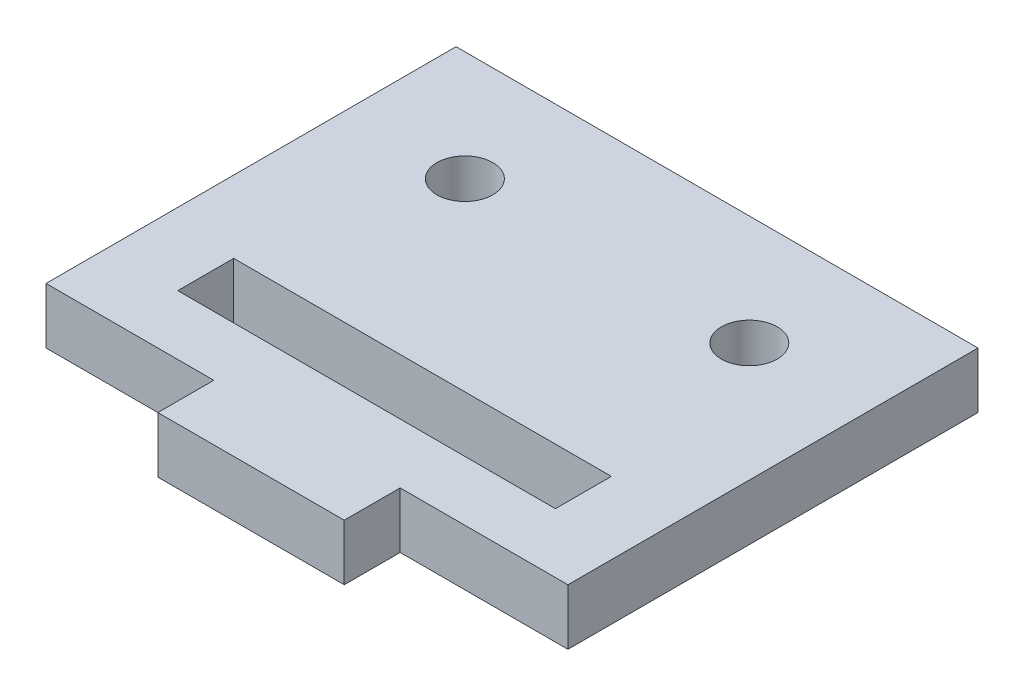
ISO-10303-21;
HEADER;
FILE_DESCRIPTION(('STEP AP214'),'2;1');
FILE_NAME('part.step','',(''),(''),'','','');
FILE_SCHEMA(('AUTOMOTIVE_DESIGN { 1 0 10303 214 1 1 1 1 }'));
ENDSEC;
DATA;
#1=APPLICATION_CONTEXT('core data for automotive mechanical design processes');
#2=APPLICATION_PROTOCOL_DEFINITION('international standard','automotive_design',2000,#1);
#3=PRODUCT_CONTEXT('',#1,'mechanical');
#4=PRODUCT('Part','Part','',(#3));
#5=PRODUCT_RELATED_PRODUCT_CATEGORY('part','',(#4));
#6=PRODUCT_DEFINITION_FORMATION('','',#4);
#7=PRODUCT_DEFINITION_CONTEXT('part definition',#1,'design');
#8=PRODUCT_DEFINITION('design','',#6,#7);
#9=PRODUCT_DEFINITION_SHAPE('','',#8);
#10=(LENGTH_UNIT() NAMED_UNIT(*) SI_UNIT(.MILLI.,.METRE.));
#11=(NAMED_UNIT(*) PLANE_ANGLE_UNIT() SI_UNIT($,.RADIAN.));
#12=(NAMED_UNIT(*) SI_UNIT($,.STERADIAN.) SOLID_ANGLE_UNIT());
#13=UNCERTAINTY_MEASURE_WITH_UNIT(LENGTH_MEASURE(1.E-05),#10,'distance_accuracy_value','');
#14=(GEOMETRIC_REPRESENTATION_CONTEXT(3) GLOBAL_UNCERTAINTY_ASSIGNED_CONTEXT((#13)) GLOBAL_UNIT_ASSIGNED_CONTEXT((#10,
#11,#12)) REPRESENTATION_CONTEXT('',''));
#15=CARTESIAN_POINT('',(0.,0.,0.));
#16=DIRECTION('',(0.,0.,1.));
#17=DIRECTION('',(1.,0.,0.));
#18=AXIS2_PLACEMENT_3D('',#15,#16,#17);
#19=CARTESIAN_POINT('',(0.,3.,0.));
#20=DIRECTION('',(0.,-1.,0.));
#21=DIRECTION('',(0.,0.,-1.));
#22=AXIS2_PLACEMENT_3D('',#19,#20,#21);
#23=PLANE('',#22);
#24=CARTESIAN_POINT('',(7.63,3.,-19.1));
#25=DIRECTION('',(0.,1.,0.));
#26=DIRECTION('',(0.,0.,1.));
#27=AXIS2_PLACEMENT_3D('',#24,#25,#26);
#28=CIRCLE('',#27,1.5);
#29=CARTESIAN_POINT('',(7.63,3.,-17.6));
#30=VERTEX_POINT('',#29);
#31=EDGE_CURVE('E161',#30,#30,#28,.T.);
#32=ORIENTED_EDGE('',*,*,#31,.F.);
#33=EDGE_LOOP('',(#32));
#34=FACE_BOUND('',#33,.T.);
#35=DIRECTION('',(0.,0.,-1.));
#36=VECTOR('',#35,1.);
#37=CARTESIAN_POINT('',(5.,3.,0.));
#38=LINE('',#37,#36);
#39=CARTESIAN_POINT('',(5.,3.,0.));
#40=VERTEX_POINT('',#39);
#41=CARTESIAN_POINT('',(5.,3.,-3.));
#42=VERTEX_POINT('',#41);
#43=EDGE_CURVE('E167',#40,#42,#38,.T.);
#44=ORIENTED_EDGE('',*,*,#43,.T.);
#45=DIRECTION('',(1.,0.,0.));
#46=VECTOR('',#45,1.);
#47=CARTESIAN_POINT('',(5.,3.,-3.));
#48=LINE('',#47,#46);
#49=CARTESIAN_POINT('',(14.,3.,-3.));
#50=VERTEX_POINT('',#49);
#51=EDGE_CURVE('E170',#42,#50,#48,.T.);
#52=ORIENTED_EDGE('',*,*,#51,.T.);
#53=DIRECTION('',(0.,0.,-1.));
#54=VECTOR('',#53,1.);
#55=CARTESIAN_POINT('',(14.,3.,-3.));
#56=LINE('',#55,#54);
#57=CARTESIAN_POINT('',(14.,3.,-25.));
#58=VERTEX_POINT('',#57);
#59=EDGE_CURVE('E173',#50,#58,#56,.T.);
#60=ORIENTED_EDGE('',*,*,#59,.T.);
#61=DIRECTION('',(-1.,0.,0.));
#62=VECTOR('',#61,1.);
#63=CARTESIAN_POINT('',(14.,3.,-25.));
#64=LINE('',#63,#62);
#65=CARTESIAN_POINT('',(-14.,3.,-25.));
#66=VERTEX_POINT('',#65);
#67=EDGE_CURVE('E175',#58,#66,#64,.T.);
#68=ORIENTED_EDGE('',*,*,#67,.T.);
#69=DIRECTION('',(0.,0.,1.));
#70=VECTOR('',#69,1.);
#71=CARTESIAN_POINT('',(-14.,3.,-3.));
#72=LINE('',#71,#70);
#73=CARTESIAN_POINT('',(-14.,3.,-3.));
#74=VERTEX_POINT('',#73);
#75=EDGE_CURVE('E177',#66,#74,#72,.T.);
#76=ORIENTED_EDGE('',*,*,#75,.T.);
#77=DIRECTION('',(1.,0.,0.));
#78=VECTOR('',#77,1.);
#79=CARTESIAN_POINT('',(-5.,3.,-3.));
#80=LINE('',#79,#78);
#81=CARTESIAN_POINT('',(-5.,3.,-3.));
#82=VERTEX_POINT('',#81);
#83=EDGE_CURVE('E179',#74,#82,#80,.T.);
#84=ORIENTED_EDGE('',*,*,#83,.T.);
#85=DIRECTION('',(0.,0.,1.));
#86=VECTOR('',#85,1.);
#87=CARTESIAN_POINT('',(-5.,3.,0.));
#88=LINE('',#87,#86);
#89=CARTESIAN_POINT('',(-5.,3.,0.));
#90=VERTEX_POINT('',#89);
#91=EDGE_CURVE('E181',#82,#90,#88,.T.);
#92=ORIENTED_EDGE('',*,*,#91,.T.);
#93=DIRECTION('',(1.,0.,0.));
#94=VECTOR('',#93,1.);
#95=CARTESIAN_POINT('',(-5.,3.,0.));
#96=LINE('',#95,#94);
#97=EDGE_CURVE('E183',#90,#40,#96,.T.);
#98=ORIENTED_EDGE('',*,*,#97,.T.);
#99=EDGE_LOOP('',(#44,#52,#60,#68,#76,#84,#92,#98));
#100=FACE_BOUND('',#99,.T.);
#101=DIRECTION('',(1.,0.,0.));
#102=VECTOR('',#101,1.);
#103=CARTESIAN_POINT('',(-10.13,3.,-6.2));
#104=LINE('',#103,#102);
#105=CARTESIAN_POINT('',(-10.13,3.,-6.2));
#106=VERTEX_POINT('',#105);
#107=CARTESIAN_POINT('',(10.13,3.,-6.2));
#108=VERTEX_POINT('',#107);
#109=EDGE_CURVE('E122',#106,#108,#104,.T.);
#110=ORIENTED_EDGE('',*,*,#109,.F.);
#111=DIRECTION('',(0.,0.,1.));
#112=VECTOR('',#111,1.);
#113=CARTESIAN_POINT('',(-10.13,3.,-6.2));
#114=LINE('',#113,#112);
#115=CARTESIAN_POINT('',(-10.13,3.,-9.2));
#116=VERTEX_POINT('',#115);
#117=EDGE_CURVE('E145',#116,#106,#114,.T.);
#118=ORIENTED_EDGE('',*,*,#117,.F.);
#119=DIRECTION('',(-1.,0.,0.));
#120=VECTOR('',#119,1.);
#121=CARTESIAN_POINT('',(10.13,3.,-9.2));
#122=LINE('',#121,#120);
#123=CARTESIAN_POINT('',(10.13,3.,-9.2));
#124=VERTEX_POINT('',#123);
#125=EDGE_CURVE('E143',#124,#116,#122,.T.);
#126=ORIENTED_EDGE('',*,*,#125,.F.);
#127=DIRECTION('',(0.,0.,-1.));
#128=VECTOR('',#127,1.);
#129=CARTESIAN_POINT('',(10.13,3.,-6.2));
#130=LINE('',#129,#128);
#131=EDGE_CURVE('E130',#108,#124,#130,.T.);
#132=ORIENTED_EDGE('',*,*,#131,.F.);
#133=EDGE_LOOP('',(#110,#118,#126,#132));
#134=FACE_BOUND('',#133,.T.);
#135=CARTESIAN_POINT('',(-7.63,3.,-19.1));
#136=DIRECTION('',(0.,1.,0.));
#137=DIRECTION('',(0.,0.,-1.));
#138=AXIS2_PLACEMENT_3D('',#135,#136,#137);
#139=CIRCLE('',#138,1.5);
#140=CARTESIAN_POINT('',(-7.63,3.,-20.6));
#141=VERTEX_POINT('',#140);
#142=EDGE_CURVE('E151',#141,#141,#139,.T.);
#143=ORIENTED_EDGE('',*,*,#142,.F.);
#144=EDGE_LOOP('',(#143));
#145=FACE_BOUND('',#144,.T.);
#146=ADVANCED_FACE('F33',(#34,#100,#134,#145),#23,.F.);
#147=CARTESIAN_POINT('',(0.,0.,0.));
#148=DIRECTION('',(0.,-1.,0.));
#149=DIRECTION('',(0.,0.,-1.));
#150=AXIS2_PLACEMENT_3D('',#147,#148,#149);
#151=PLANE('',#150);
#152=DIRECTION('',(0.,0.,1.));
#153=VECTOR('',#152,1.);
#154=CARTESIAN_POINT('',(-10.13,0.,-6.2));
#155=LINE('',#154,#153);
#156=CARTESIAN_POINT('',(-10.13,0.,-9.2));
#157=VERTEX_POINT('',#156);
#158=CARTESIAN_POINT('',(-10.13,0.,-6.2));
#159=VERTEX_POINT('',#158);
#160=EDGE_CURVE('E131',#157,#159,#155,.T.);
#161=ORIENTED_EDGE('',*,*,#160,.T.);
#162=DIRECTION('',(1.,0.,0.));
#163=VECTOR('',#162,1.);
#164=CARTESIAN_POINT('',(-10.13,0.,-6.2));
#165=LINE('',#164,#163);
#166=CARTESIAN_POINT('',(10.13,0.,-6.2));
#167=VERTEX_POINT('',#166);
#168=EDGE_CURVE('E56',#159,#167,#165,.T.);
#169=ORIENTED_EDGE('',*,*,#168,.T.);
#170=DIRECTION('',(0.,0.,-1.));
#171=VECTOR('',#170,1.);
#172=CARTESIAN_POINT('',(10.13,0.,-6.2));
#173=LINE('',#172,#171);
#174=CARTESIAN_POINT('',(10.13,0.,-9.2));
#175=VERTEX_POINT('',#174);
#176=EDGE_CURVE('E137',#167,#175,#173,.T.);
#177=ORIENTED_EDGE('',*,*,#176,.T.);
#178=DIRECTION('',(-1.,0.,0.));
#179=VECTOR('',#178,1.);
#180=CARTESIAN_POINT('',(10.13,0.,-9.2));
#181=LINE('',#180,#179);
#182=EDGE_CURVE('E153',#175,#157,#181,.T.);
#183=ORIENTED_EDGE('',*,*,#182,.T.);
#184=EDGE_LOOP('',(#161,#169,#177,#183));
#185=FACE_BOUND('',#184,.T.);
#186=CARTESIAN_POINT('',(7.63,0.,-19.1));
#187=DIRECTION('',(0.,1.,0.));
#188=DIRECTION('',(0.,0.,1.));
#189=AXIS2_PLACEMENT_3D('',#186,#187,#188);
#190=CIRCLE('',#189,1.5);
#191=CARTESIAN_POINT('',(7.63,0.,-17.6));
#192=VERTEX_POINT('',#191);
#193=EDGE_CURVE('E138',#192,#192,#190,.T.);
#194=ORIENTED_EDGE('',*,*,#193,.T.);
#195=EDGE_LOOP('',(#194));
#196=FACE_BOUND('',#195,.T.);
#197=DIRECTION('',(0.,0.,-1.));
#198=VECTOR('',#197,1.);
#199=CARTESIAN_POINT('',(5.,0.,0.));
#200=LINE('',#199,#198);
#201=CARTESIAN_POINT('',(5.,0.,0.));
#202=VERTEX_POINT('',#201);
#203=CARTESIAN_POINT('',(5.,0.,-3.));
#204=VERTEX_POINT('',#203);
#205=EDGE_CURVE('E164',#202,#204,#200,.T.);
#206=ORIENTED_EDGE('',*,*,#205,.F.);
#207=DIRECTION('',(1.,0.,0.));
#208=VECTOR('',#207,1.);
#209=CARTESIAN_POINT('',(-5.,0.,0.));
#210=LINE('',#209,#208);
#211=CARTESIAN_POINT('',(-5.,0.,0.));
#212=VERTEX_POINT('',#211);
#213=EDGE_CURVE('E171',#212,#202,#210,.T.);
#214=ORIENTED_EDGE('',*,*,#213,.F.);
#215=DIRECTION('',(0.,0.,1.));
#216=VECTOR('',#215,1.);
#217=CARTESIAN_POINT('',(-5.,0.,0.));
#218=LINE('',#217,#216);
#219=CARTESIAN_POINT('',(-5.,0.,-3.));
#220=VERTEX_POINT('',#219);
#221=EDGE_CURVE('E198',#220,#212,#218,.T.);
#222=ORIENTED_EDGE('',*,*,#221,.F.);
#223=DIRECTION('',(1.,0.,0.));
#224=VECTOR('',#223,1.);
#225=CARTESIAN_POINT('',(-5.,0.,-3.));
#226=LINE('',#225,#224);
#227=CARTESIAN_POINT('',(-14.,0.,-3.));
#228=VERTEX_POINT('',#227);
#229=EDGE_CURVE('E196',#228,#220,#226,.T.);
#230=ORIENTED_EDGE('',*,*,#229,.F.);
#231=DIRECTION('',(0.,0.,1.));
#232=VECTOR('',#231,1.);
#233=CARTESIAN_POINT('',(-14.,0.,-3.));
#234=LINE('',#233,#232);
#235=CARTESIAN_POINT('',(-14.,0.,-25.));
#236=VERTEX_POINT('',#235);
#237=EDGE_CURVE('E194',#236,#228,#234,.T.);
#238=ORIENTED_EDGE('',*,*,#237,.F.);
#239=DIRECTION('',(-1.,0.,0.));
#240=VECTOR('',#239,1.);
#241=CARTESIAN_POINT('',(14.,0.,-25.));
#242=LINE('',#241,#240);
#243=CARTESIAN_POINT('',(14.,0.,-25.));
#244=VERTEX_POINT('',#243);
#245=EDGE_CURVE('E192',#244,#236,#242,.T.);
#246=ORIENTED_EDGE('',*,*,#245,.F.);
#247=DIRECTION('',(0.,0.,-1.));
#248=VECTOR('',#247,1.);
#249=CARTESIAN_POINT('',(14.,0.,-3.));
#250=LINE('',#249,#248);
#251=CARTESIAN_POINT('',(14.,0.,-3.));
#252=VERTEX_POINT('',#251);
#253=EDGE_CURVE('E190',#252,#244,#250,.T.);
#254=ORIENTED_EDGE('',*,*,#253,.F.);
#255=DIRECTION('',(1.,0.,0.));
#256=VECTOR('',#255,1.);
#257=CARTESIAN_POINT('',(5.,0.,-3.));
#258=LINE('',#257,#256);
#259=EDGE_CURVE('E188',#204,#252,#258,.T.);
#260=ORIENTED_EDGE('',*,*,#259,.F.);
#261=EDGE_LOOP('',(#206,#214,#222,#230,#238,#246,#254,#260));
#262=FACE_BOUND('',#261,.T.);
#263=CARTESIAN_POINT('',(-7.63,0.,-19.1));
#264=DIRECTION('',(0.,1.,0.));
#265=DIRECTION('',(0.,0.,-1.));
#266=AXIS2_PLACEMENT_3D('',#263,#264,#265);
#267=CIRCLE('',#266,1.5);
#268=CARTESIAN_POINT('',(-7.63,0.,-20.6));
#269=VERTEX_POINT('',#268);
#270=EDGE_CURVE('E313',#269,#269,#267,.T.);
#271=ORIENTED_EDGE('',*,*,#270,.T.);
#272=EDGE_LOOP('',(#271));
#273=FACE_BOUND('',#272,.T.);
#274=ADVANCED_FACE('F228',(#185,#196,#262,#273),#151,.T.);
#275=CARTESIAN_POINT('',(5.,3.,0.));
#276=DIRECTION('',(-1.,0.,0.));
#277=DIRECTION('',(0.,0.,1.));
#278=AXIS2_PLACEMENT_3D('',#275,#276,#277);
#279=PLANE('',#278);
#280=ORIENTED_EDGE('',*,*,#205,.T.);
#281=DIRECTION('',(0.,-1.,0.));
#282=VECTOR('',#281,1.);
#283=CARTESIAN_POINT('',(5.,3.,-3.));
#284=LINE('',#283,#282);
#285=EDGE_CURVE('E11',#42,#204,#284,.T.);
#286=ORIENTED_EDGE('',*,*,#285,.F.);
#287=ORIENTED_EDGE('',*,*,#43,.F.);
#288=DIRECTION('',(0.,-1.,0.));
#289=VECTOR('',#288,1.);
#290=CARTESIAN_POINT('',(5.,3.,0.));
#291=LINE('',#290,#289);
#292=EDGE_CURVE('E185',#40,#202,#291,.T.);
#293=ORIENTED_EDGE('',*,*,#292,.T.);
#294=EDGE_LOOP('',(#280,#286,#287,#293));
#295=FACE_BOUND('',#294,.T.);
#296=ADVANCED_FACE('F35',(#295),#279,.F.);
#297=CARTESIAN_POINT('',(5.,3.,-3.));
#298=DIRECTION('',(0.,0.,-1.));
#299=DIRECTION('',(-1.,0.,0.));
#300=AXIS2_PLACEMENT_3D('',#297,#298,#299);
#301=PLANE('',#300);
#302=ORIENTED_EDGE('',*,*,#259,.T.);
#303=DIRECTION('',(0.,-1.,0.));
#304=VECTOR('',#303,1.);
#305=CARTESIAN_POINT('',(14.,3.,-3.));
#306=LINE('',#305,#304);
#307=EDGE_CURVE('E41',#50,#252,#306,.T.);
#308=ORIENTED_EDGE('',*,*,#307,.F.);
#309=ORIENTED_EDGE('',*,*,#51,.F.);
#310=ORIENTED_EDGE('',*,*,#285,.T.);
#311=EDGE_LOOP('',(#302,#308,#309,#310));
#312=FACE_BOUND('',#311,.T.);
#313=ADVANCED_FACE('F245',(#312),#301,.F.);
#314=CARTESIAN_POINT('',(14.,3.,-3.));
#315=DIRECTION('',(-1.,0.,0.));
#316=DIRECTION('',(0.,0.,1.));
#317=AXIS2_PLACEMENT_3D('',#314,#315,#316);
#318=PLANE('',#317);
#319=ORIENTED_EDGE('',*,*,#253,.T.);
#320=DIRECTION('',(0.,-1.,0.));
#321=VECTOR('',#320,1.);
#322=CARTESIAN_POINT('',(14.,3.,-25.));
#323=LINE('',#322,#321);
#324=EDGE_CURVE('E215',#58,#244,#323,.T.);
#325=ORIENTED_EDGE('',*,*,#324,.F.);
#326=ORIENTED_EDGE('',*,*,#59,.F.);
#327=ORIENTED_EDGE('',*,*,#307,.T.);
#328=EDGE_LOOP('',(#319,#325,#326,#327));
#329=FACE_BOUND('',#328,.T.);
#330=ADVANCED_FACE('F222',(#329),#318,.F.);
#331=CARTESIAN_POINT('',(14.,3.,-25.));
#332=DIRECTION('',(0.,0.,1.));
#333=DIRECTION('',(1.,0.,0.));
#334=AXIS2_PLACEMENT_3D('',#331,#332,#333);
#335=PLANE('',#334);
#336=ORIENTED_EDGE('',*,*,#245,.T.);
#337=DIRECTION('',(0.,-1.,0.));
#338=VECTOR('',#337,1.);
#339=CARTESIAN_POINT('',(-14.,3.,-25.));
#340=LINE('',#339,#338);
#341=EDGE_CURVE('E212',#66,#236,#340,.T.);
#342=ORIENTED_EDGE('',*,*,#341,.F.);
#343=ORIENTED_EDGE('',*,*,#67,.F.);
#344=ORIENTED_EDGE('',*,*,#324,.T.);
#345=EDGE_LOOP('',(#336,#342,#343,#344));
#346=FACE_BOUND('',#345,.T.);
#347=ADVANCED_FACE('F234',(#346),#335,.F.);
#348=CARTESIAN_POINT('',(-14.,3.,-3.));
#349=DIRECTION('',(1.,0.,0.));
#350=DIRECTION('',(0.,0.,-1.));
#351=AXIS2_PLACEMENT_3D('',#348,#349,#350);
#352=PLANE('',#351);
#353=ORIENTED_EDGE('',*,*,#237,.T.);
#354=DIRECTION('',(0.,-1.,0.));
#355=VECTOR('',#354,1.);
#356=CARTESIAN_POINT('',(-14.,3.,-3.));
#357=LINE('',#356,#355);
#358=EDGE_CURVE('E209',#74,#228,#357,.T.);
#359=ORIENTED_EDGE('',*,*,#358,.F.);
#360=ORIENTED_EDGE('',*,*,#75,.F.);
#361=ORIENTED_EDGE('',*,*,#341,.T.);
#362=EDGE_LOOP('',(#353,#359,#360,#361));
#363=FACE_BOUND('',#362,.T.);
#364=ADVANCED_FACE('F238',(#363),#352,.F.);
#365=CARTESIAN_POINT('',(-5.,3.,-3.));
#366=DIRECTION('',(0.,0.,-1.));
#367=DIRECTION('',(-1.,0.,0.));
#368=AXIS2_PLACEMENT_3D('',#365,#366,#367);
#369=PLANE('',#368);
#370=ORIENTED_EDGE('',*,*,#229,.T.);
#371=DIRECTION('',(0.,-1.,0.));
#372=VECTOR('',#371,1.);
#373=CARTESIAN_POINT('',(-5.,3.,-3.));
#374=LINE('',#373,#372);
#375=EDGE_CURVE('E206',#82,#220,#374,.T.);
#376=ORIENTED_EDGE('',*,*,#375,.F.);
#377=ORIENTED_EDGE('',*,*,#83,.F.);
#378=ORIENTED_EDGE('',*,*,#358,.T.);
#379=EDGE_LOOP('',(#370,#376,#377,#378));
#380=FACE_BOUND('',#379,.T.);
#381=ADVANCED_FACE('F258',(#380),#369,.F.);
#382=CARTESIAN_POINT('',(-5.,3.,0.));
#383=DIRECTION('',(1.,0.,0.));
#384=DIRECTION('',(0.,0.,-1.));
#385=AXIS2_PLACEMENT_3D('',#382,#383,#384);
#386=PLANE('',#385);
#387=ORIENTED_EDGE('',*,*,#221,.T.);
#388=DIRECTION('',(0.,-1.,0.));
#389=VECTOR('',#388,1.);
#390=CARTESIAN_POINT('',(-5.,3.,0.));
#391=LINE('',#390,#389);
#392=EDGE_CURVE('E203',#90,#212,#391,.T.);
#393=ORIENTED_EDGE('',*,*,#392,.F.);
#394=ORIENTED_EDGE('',*,*,#91,.F.);
#395=ORIENTED_EDGE('',*,*,#375,.T.);
#396=EDGE_LOOP('',(#387,#393,#394,#395));
#397=FACE_BOUND('',#396,.T.);
#398=ADVANCED_FACE('F256',(#397),#386,.F.);
#399=CARTESIAN_POINT('',(-5.,3.,0.));
#400=DIRECTION('',(0.,0.,-1.));
#401=DIRECTION('',(-1.,0.,0.));
#402=AXIS2_PLACEMENT_3D('',#399,#400,#401);
#403=PLANE('',#402);
#404=ORIENTED_EDGE('',*,*,#213,.T.);
#405=ORIENTED_EDGE('',*,*,#292,.F.);
#406=ORIENTED_EDGE('',*,*,#97,.F.);
#407=ORIENTED_EDGE('',*,*,#392,.T.);
#408=EDGE_LOOP('',(#404,#405,#406,#407));
#409=FACE_BOUND('',#408,.T.);
#410=ADVANCED_FACE('F251',(#409),#403,.F.);
#411=CARTESIAN_POINT('',(7.63,3.,-19.1));
#412=DIRECTION('',(0.,-1.,0.));
#413=DIRECTION('',(0.,0.,-1.));
#414=AXIS2_PLACEMENT_3D('',#411,#412,#413);
#415=CYLINDRICAL_SURFACE('',#414,1.5);
#416=ORIENTED_EDGE('',*,*,#31,.T.);
#417=EDGE_LOOP('',(#416));
#418=FACE_BOUND('',#417,.T.);
#419=ORIENTED_EDGE('',*,*,#193,.F.);
#420=EDGE_LOOP('',(#419));
#421=FACE_BOUND('',#420,.T.);
#422=ADVANCED_FACE('F277',(#418,#421),#415,.F.);
#423=CARTESIAN_POINT('',(-10.13,3.,-6.2));
#424=DIRECTION('',(0.,0.,-1.));
#425=DIRECTION('',(-1.,0.,0.));
#426=AXIS2_PLACEMENT_3D('',#423,#424,#425);
#427=PLANE('',#426);
#428=ORIENTED_EDGE('',*,*,#168,.F.);
#429=DIRECTION('',(0.,-1.,0.));
#430=VECTOR('',#429,1.);
#431=CARTESIAN_POINT('',(-10.13,3.,-6.2));
#432=LINE('',#431,#430);
#433=EDGE_CURVE('E126',#106,#159,#432,.T.);
#434=ORIENTED_EDGE('',*,*,#433,.F.);
#435=ORIENTED_EDGE('',*,*,#109,.T.);
#436=DIRECTION('',(0.,-1.,0.));
#437=VECTOR('',#436,1.);
#438=CARTESIAN_POINT('',(10.13,3.,-6.2));
#439=LINE('',#438,#437);
#440=EDGE_CURVE('E125',#108,#167,#439,.T.);
#441=ORIENTED_EDGE('',*,*,#440,.T.);
#442=EDGE_LOOP('',(#428,#434,#435,#441));
#443=FACE_BOUND('',#442,.T.);
#444=ADVANCED_FACE('F124',(#443),#427,.T.);
#445=CARTESIAN_POINT('',(10.13,3.,-6.2));
#446=DIRECTION('',(-1.,0.,0.));
#447=DIRECTION('',(0.,0.,1.));
#448=AXIS2_PLACEMENT_3D('',#445,#446,#447);
#449=PLANE('',#448);
#450=ORIENTED_EDGE('',*,*,#176,.F.);
#451=ORIENTED_EDGE('',*,*,#440,.F.);
#452=ORIENTED_EDGE('',*,*,#131,.T.);
#453=DIRECTION('',(0.,-1.,0.));
#454=VECTOR('',#453,1.);
#455=CARTESIAN_POINT('',(10.13,3.,-9.2));
#456=LINE('',#455,#454);
#457=EDGE_CURVE('E139',#124,#175,#456,.T.);
#458=ORIENTED_EDGE('',*,*,#457,.T.);
#459=EDGE_LOOP('',(#450,#451,#452,#458));
#460=FACE_BOUND('',#459,.T.);
#461=ADVANCED_FACE('F134',(#460),#449,.T.);
#462=CARTESIAN_POINT('',(10.13,3.,-9.2));
#463=DIRECTION('',(0.,0.,1.));
#464=DIRECTION('',(1.,0.,0.));
#465=AXIS2_PLACEMENT_3D('',#462,#463,#464);
#466=PLANE('',#465);
#467=ORIENTED_EDGE('',*,*,#182,.F.);
#468=ORIENTED_EDGE('',*,*,#457,.F.);
#469=ORIENTED_EDGE('',*,*,#125,.T.);
#470=DIRECTION('',(0.,-1.,0.));
#471=VECTOR('',#470,1.);
#472=CARTESIAN_POINT('',(-10.13,3.,-9.2));
#473=LINE('',#472,#471);
#474=EDGE_CURVE('E48',#116,#157,#473,.T.);
#475=ORIENTED_EDGE('',*,*,#474,.T.);
#476=EDGE_LOOP('',(#467,#468,#469,#475));
#477=FACE_BOUND('',#476,.T.);
#478=ADVANCED_FACE('F294',(#477),#466,.T.);
#479=CARTESIAN_POINT('',(-10.13,3.,-6.2));
#480=DIRECTION('',(1.,0.,0.));
#481=DIRECTION('',(0.,0.,-1.));
#482=AXIS2_PLACEMENT_3D('',#479,#480,#481);
#483=PLANE('',#482);
#484=ORIENTED_EDGE('',*,*,#160,.F.);
#485=ORIENTED_EDGE('',*,*,#474,.F.);
#486=ORIENTED_EDGE('',*,*,#117,.T.);
#487=ORIENTED_EDGE('',*,*,#433,.T.);
#488=EDGE_LOOP('',(#484,#485,#486,#487));
#489=FACE_BOUND('',#488,.T.);
#490=ADVANCED_FACE('F299',(#489),#483,.T.);
#491=CARTESIAN_POINT('',(-7.63,3.,-19.1));
#492=DIRECTION('',(0.,-1.,0.));
#493=DIRECTION('',(0.,0.,-1.));
#494=AXIS2_PLACEMENT_3D('',#491,#492,#493);
#495=CYLINDRICAL_SURFACE('',#494,1.5);
#496=ORIENTED_EDGE('',*,*,#142,.T.);
#497=EDGE_LOOP('',(#496));
#498=FACE_BOUND('',#497,.T.);
#499=ORIENTED_EDGE('',*,*,#270,.F.);
#500=EDGE_LOOP('',(#499));
#501=FACE_BOUND('',#500,.T.);
#502=ADVANCED_FACE('F303',(#498,#501),#495,.F.);
#503=CLOSED_SHELL('',(#146,#274,#296,#313,#330,#347,#364,#381,#398,#410,#422,#444,#461,#478,
#490,#502));
#504=MANIFOLD_SOLID_BREP('B2',#503);
#505=ADVANCED_BREP_SHAPE_REPRESENTATION('',(#18,#504),#14);
#506=SHAPE_DEFINITION_REPRESENTATION(#9,#505);
ENDSEC;
END-ISO-10303-21;
